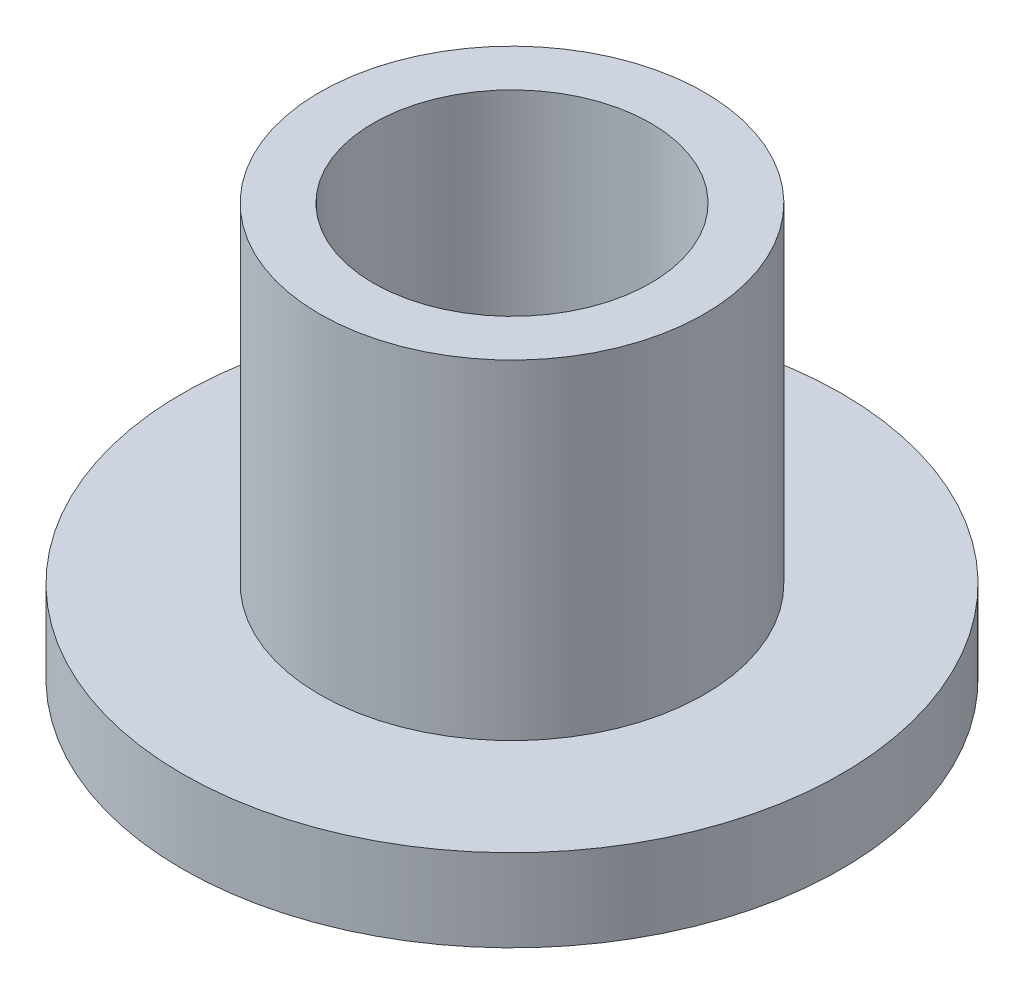
ISO-10303-21;
HEADER;
FILE_DESCRIPTION(('STEP AP214'),'2;1');
FILE_NAME('part.step','',(''),(''),'','','');
FILE_SCHEMA(('AUTOMOTIVE_DESIGN { 1 0 10303 214 1 1 1 1 }'));
ENDSEC;
DATA;
#1=APPLICATION_CONTEXT('core data for automotive mechanical design processes');
#2=APPLICATION_PROTOCOL_DEFINITION('international standard','automotive_design',2000,#1);
#3=PRODUCT_CONTEXT('',#1,'mechanical');
#4=PRODUCT('Part','Part','',(#3));
#5=PRODUCT_RELATED_PRODUCT_CATEGORY('part','',(#4));
#6=PRODUCT_DEFINITION_FORMATION('','',#4);
#7=PRODUCT_DEFINITION_CONTEXT('part definition',#1,'design');
#8=PRODUCT_DEFINITION('design','',#6,#7);
#9=PRODUCT_DEFINITION_SHAPE('','',#8);
#10=(LENGTH_UNIT() NAMED_UNIT(*) SI_UNIT(.MILLI.,.METRE.));
#11=(NAMED_UNIT(*) PLANE_ANGLE_UNIT() SI_UNIT($,.RADIAN.));
#12=(NAMED_UNIT(*) SI_UNIT($,.STERADIAN.) SOLID_ANGLE_UNIT());
#13=UNCERTAINTY_MEASURE_WITH_UNIT(LENGTH_MEASURE(1.E-05),#10,'distance_accuracy_value','');
#14=(GEOMETRIC_REPRESENTATION_CONTEXT(3) GLOBAL_UNCERTAINTY_ASSIGNED_CONTEXT((#13)) GLOBAL_UNIT_ASSIGNED_CONTEXT((#10,
#11,#12)) REPRESENTATION_CONTEXT('',''));
#15=CARTESIAN_POINT('',(0.,0.,0.));
#16=DIRECTION('',(0.,0.,1.));
#17=DIRECTION('',(1.,0.,0.));
#18=AXIS2_PLACEMENT_3D('',#15,#16,#17);
#19=CARTESIAN_POINT('',(0.,3.,0.));
#20=DIRECTION('',(0.,-1.,0.));
#21=DIRECTION('',(0.,0.,-1.));
#22=AXIS2_PLACEMENT_3D('',#19,#20,#21);
#23=CYLINDRICAL_SURFACE('',#22,12.);
#24=CARTESIAN_POINT('',(0.,3.,0.));
#25=DIRECTION('',(0.,1.,0.));
#26=DIRECTION('',(0.,0.,1.));
#27=AXIS2_PLACEMENT_3D('',#24,#25,#26);
#28=CIRCLE('',#27,12.);
#29=CARTESIAN_POINT('',(0.,3.,12.));
#30=VERTEX_POINT('',#29);
#31=EDGE_CURVE('E51',#30,#30,#28,.T.);
#32=ORIENTED_EDGE('',*,*,#31,.F.);
#33=EDGE_LOOP('',(#32));
#34=FACE_BOUND('',#33,.T.);
#35=CARTESIAN_POINT('',(0.,0.,0.));
#36=DIRECTION('',(0.,1.,0.));
#37=DIRECTION('',(0.,0.,1.));
#38=AXIS2_PLACEMENT_3D('',#35,#36,#37);
#39=CIRCLE('',#38,12.);
#40=CARTESIAN_POINT('',(0.,0.,12.));
#41=VERTEX_POINT('',#40);
#42=EDGE_CURVE('E46',#41,#41,#39,.T.);
#43=ORIENTED_EDGE('',*,*,#42,.T.);
#44=EDGE_LOOP('',(#43));
#45=FACE_BOUND('',#44,.T.);
#46=ADVANCED_FACE('F43',(#34,#45),#23,.T.);
#47=CARTESIAN_POINT('',(0.,3.,0.));
#48=DIRECTION('',(0.,1.,0.));
#49=DIRECTION('',(0.,0.,1.));
#50=AXIS2_PLACEMENT_3D('',#47,#48,#49);
#51=PLANE('',#50);
#52=CARTESIAN_POINT('',(0.,3.,0.));
#53=DIRECTION('',(0.,1.,0.));
#54=DIRECTION('',(0.,0.,1.));
#55=AXIS2_PLACEMENT_3D('',#52,#53,#54);
#56=CIRCLE('',#55,7.);
#57=CARTESIAN_POINT('',(0.,3.,7.));
#58=VERTEX_POINT('',#57);
#59=EDGE_CURVE('E10',#58,#58,#56,.T.);
#60=ORIENTED_EDGE('',*,*,#59,.F.);
#61=EDGE_LOOP('',(#60));
#62=FACE_BOUND('',#61,.T.);
#63=ORIENTED_EDGE('',*,*,#31,.T.);
#64=EDGE_LOOP('',(#63));
#65=FACE_BOUND('',#64,.T.);
#66=ADVANCED_FACE('F93',(#62,#65),#51,.T.);
#67=CARTESIAN_POINT('',(0.,0.,0.));
#68=DIRECTION('',(0.,1.,0.));
#69=DIRECTION('',(0.,0.,1.));
#70=AXIS2_PLACEMENT_3D('',#67,#68,#69);
#71=PLANE('',#70);
#72=CARTESIAN_POINT('',(0.,0.,0.));
#73=DIRECTION('',(0.,1.,0.));
#74=DIRECTION('',(0.,0.,1.));
#75=AXIS2_PLACEMENT_3D('',#72,#73,#74);
#76=CIRCLE('',#75,5.05);
#77=CARTESIAN_POINT('',(0.,0.,5.05));
#78=VERTEX_POINT('',#77);
#79=EDGE_CURVE('E62',#78,#78,#76,.T.);
#80=ORIENTED_EDGE('',*,*,#79,.T.);
#81=EDGE_LOOP('',(#80));
#82=FACE_BOUND('',#81,.T.);
#83=ORIENTED_EDGE('',*,*,#42,.F.);
#84=EDGE_LOOP('',(#83));
#85=FACE_BOUND('',#84,.T.);
#86=ADVANCED_FACE('F71',(#82,#85),#71,.F.);
#87=CARTESIAN_POINT('',(0.,15.,0.));
#88=DIRECTION('',(0.,-1.,0.));
#89=DIRECTION('',(0.,0.,-1.));
#90=AXIS2_PLACEMENT_3D('',#87,#88,#89);
#91=CYLINDRICAL_SURFACE('',#90,7.);
#92=CARTESIAN_POINT('',(0.,15.,0.));
#93=DIRECTION('',(0.,1.,0.));
#94=DIRECTION('',(0.,0.,1.));
#95=AXIS2_PLACEMENT_3D('',#92,#93,#94);
#96=CIRCLE('',#95,7.);
#97=CARTESIAN_POINT('',(0.,15.,7.));
#98=VERTEX_POINT('',#97);
#99=EDGE_CURVE('E58',#98,#98,#96,.T.);
#100=ORIENTED_EDGE('',*,*,#99,.F.);
#101=EDGE_LOOP('',(#100));
#102=FACE_BOUND('',#101,.T.);
#103=ORIENTED_EDGE('',*,*,#59,.T.);
#104=EDGE_LOOP('',(#103));
#105=FACE_BOUND('',#104,.T.);
#106=ADVANCED_FACE('F83',(#102,#105),#91,.T.);
#107=CARTESIAN_POINT('',(0.,15.,0.));
#108=DIRECTION('',(0.,1.,0.));
#109=DIRECTION('',(0.,0.,1.));
#110=AXIS2_PLACEMENT_3D('',#107,#108,#109);
#111=PLANE('',#110);
#112=CARTESIAN_POINT('',(0.,15.,0.));
#113=DIRECTION('',(0.,1.,0.));
#114=DIRECTION('',(0.,0.,1.));
#115=AXIS2_PLACEMENT_3D('',#112,#113,#114);
#116=CIRCLE('',#115,5.05);
#117=CARTESIAN_POINT('',(0.,15.,5.05));
#118=VERTEX_POINT('',#117);
#119=EDGE_CURVE('E63',#118,#118,#116,.T.);
#120=ORIENTED_EDGE('',*,*,#119,.F.);
#121=EDGE_LOOP('',(#120));
#122=FACE_BOUND('',#121,.T.);
#123=ORIENTED_EDGE('',*,*,#99,.T.);
#124=EDGE_LOOP('',(#123));
#125=FACE_BOUND('',#124,.T.);
#126=ADVANCED_FACE('F77',(#122,#125),#111,.T.);
#127=CARTESIAN_POINT('',(0.,0.,0.));
#128=DIRECTION('',(0.,1.,0.));
#129=DIRECTION('',(0.,0.,1.));
#130=AXIS2_PLACEMENT_3D('',#127,#128,#129);
#131=CYLINDRICAL_SURFACE('',#130,5.05);
#132=ORIENTED_EDGE('',*,*,#79,.F.);
#133=EDGE_LOOP('',(#132));
#134=FACE_BOUND('',#133,.T.);
#135=ORIENTED_EDGE('',*,*,#119,.T.);
#136=EDGE_LOOP('',(#135));
#137=FACE_BOUND('',#136,.T.);
#138=ADVANCED_FACE('F74',(#134,#137),#131,.F.);
#139=CLOSED_SHELL('',(#46,#66,#86,#106,#126,#138));
#140=MANIFOLD_SOLID_BREP('B2',#139);
#141=ADVANCED_BREP_SHAPE_REPRESENTATION('',(#18,#140),#14);
#142=SHAPE_DEFINITION_REPRESENTATION(#9,#141);
ENDSEC;
END-ISO-10303-21;
